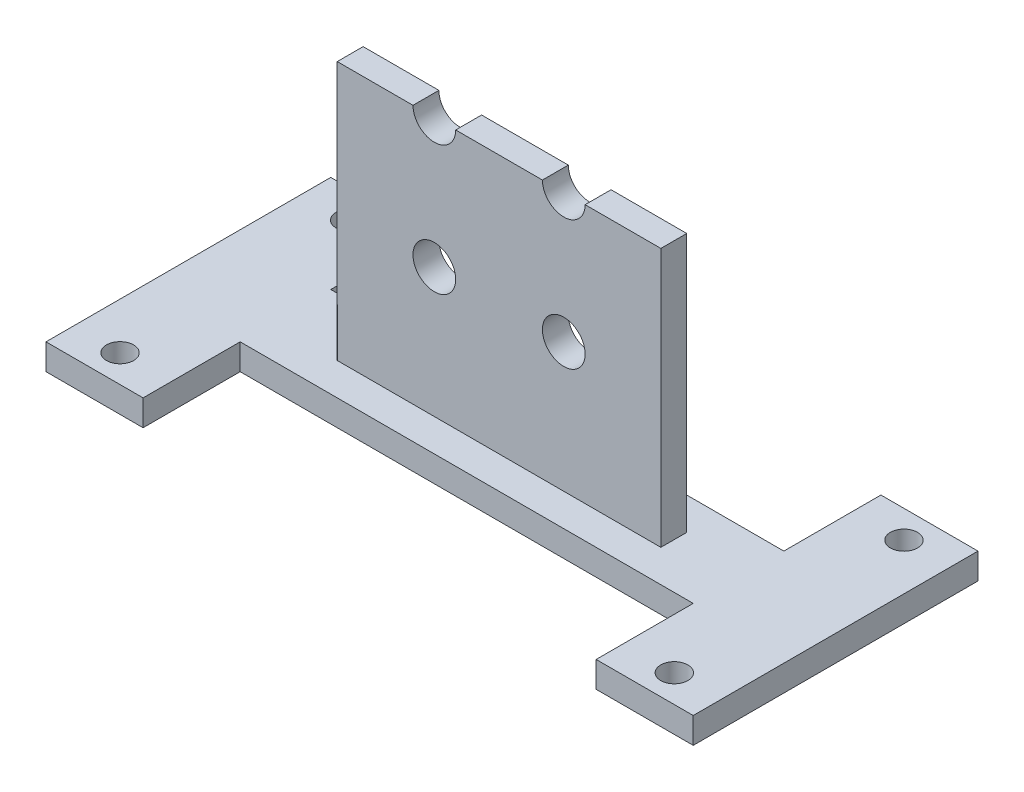
ISO-10303-21;
HEADER;
FILE_DESCRIPTION(('STEP AP214'),'2;1');
FILE_NAME('part.step','',(''),(''),'','','');
FILE_SCHEMA(('AUTOMOTIVE_DESIGN { 1 0 10303 214 1 1 1 1 }'));
ENDSEC;
DATA;
#1=APPLICATION_CONTEXT('core data for automotive mechanical design processes');
#2=APPLICATION_PROTOCOL_DEFINITION('international standard','automotive_design',2000,#1);
#3=PRODUCT_CONTEXT('',#1,'mechanical');
#4=PRODUCT('Part','Part','',(#3));
#5=PRODUCT_RELATED_PRODUCT_CATEGORY('part','',(#4));
#6=PRODUCT_DEFINITION_FORMATION('','',#4);
#7=PRODUCT_DEFINITION_CONTEXT('part definition',#1,'design');
#8=PRODUCT_DEFINITION('design','',#6,#7);
#9=PRODUCT_DEFINITION_SHAPE('','',#8);
#10=(LENGTH_UNIT() NAMED_UNIT(*) SI_UNIT(.MILLI.,.METRE.));
#11=(NAMED_UNIT(*) PLANE_ANGLE_UNIT() SI_UNIT($,.RADIAN.));
#12=(NAMED_UNIT(*) SI_UNIT($,.STERADIAN.) SOLID_ANGLE_UNIT());
#13=UNCERTAINTY_MEASURE_WITH_UNIT(LENGTH_MEASURE(1.E-05),#10,'distance_accuracy_value','');
#14=(GEOMETRIC_REPRESENTATION_CONTEXT(3) GLOBAL_UNCERTAINTY_ASSIGNED_CONTEXT((#13)) GLOBAL_UNIT_ASSIGNED_CONTEXT((#10,
#11,#12)) REPRESENTATION_CONTEXT('',''));
#15=CARTESIAN_POINT('',(0.,0.,0.));
#16=DIRECTION('',(0.,0.,1.));
#17=DIRECTION('',(1.,0.,0.));
#18=AXIS2_PLACEMENT_3D('',#15,#16,#17);
#19=CARTESIAN_POINT('',(-25.,2.,-11.));
#20=DIRECTION('',(0.,0.,1.));
#21=DIRECTION('',(1.,0.,0.));
#22=AXIS2_PLACEMENT_3D('',#19,#20,#21);
#23=PLANE('',#22);
#24=DIRECTION('',(-1.,0.,0.));
#25=VECTOR('',#24,1.);
#26=CARTESIAN_POINT('',(-25.,2.,-11.));
#27=LINE('',#26,#25);
#28=CARTESIAN_POINT('',(-17.5,2.,-11.));
#29=VERTEX_POINT('',#28);
#30=CARTESIAN_POINT('',(-25.,2.,-11.));
#31=VERTEX_POINT('',#30);
#32=EDGE_CURVE('E359',#29,#31,#27,.T.);
#33=ORIENTED_EDGE('',*,*,#32,.F.);
#34=DIRECTION('',(0.,-1.,0.));
#35=VECTOR('',#34,1.);
#36=CARTESIAN_POINT('',(-17.5,2.,-11.));
#37=LINE('',#36,#35);
#38=CARTESIAN_POINT('',(-17.5,0.,-11.));
#39=VERTEX_POINT('',#38);
#40=EDGE_CURVE('E427',#29,#39,#37,.T.);
#41=ORIENTED_EDGE('',*,*,#40,.T.);
#42=DIRECTION('',(-1.,0.,0.));
#43=VECTOR('',#42,1.);
#44=CARTESIAN_POINT('',(-25.,0.,-11.));
#45=LINE('',#44,#43);
#46=CARTESIAN_POINT('',(-25.,0.,-11.));
#47=VERTEX_POINT('',#46);
#48=EDGE_CURVE('E376',#39,#47,#45,.T.);
#49=ORIENTED_EDGE('',*,*,#48,.T.);
#50=DIRECTION('',(0.,-1.,0.));
#51=VECTOR('',#50,1.);
#52=CARTESIAN_POINT('',(-25.,2.,-11.));
#53=LINE('',#52,#51);
#54=EDGE_CURVE('E395',#31,#47,#53,.T.);
#55=ORIENTED_EDGE('',*,*,#54,.F.);
#56=EDGE_LOOP('',(#33,#41,#49,#55));
#57=FACE_BOUND('',#56,.T.);
#58=ADVANCED_FACE('F45',(#57),#23,.F.);
#59=CARTESIAN_POINT('',(-25.,2.,11.));
#60=DIRECTION('',(0.,0.,-1.));
#61=DIRECTION('',(-1.,0.,0.));
#62=AXIS2_PLACEMENT_3D('',#59,#60,#61);
#63=PLANE('',#62);
#64=DIRECTION('',(1.,0.,0.));
#65=VECTOR('',#64,1.);
#66=CARTESIAN_POINT('',(-25.,2.,11.));
#67=LINE('',#66,#65);
#68=CARTESIAN_POINT('',(17.5,2.,11.));
#69=VERTEX_POINT('',#68);
#70=CARTESIAN_POINT('',(25.,2.,11.));
#71=VERTEX_POINT('',#70);
#72=EDGE_CURVE('E368',#69,#71,#67,.T.);
#73=ORIENTED_EDGE('',*,*,#72,.F.);
#74=DIRECTION('',(0.,-1.,0.));
#75=VECTOR('',#74,1.);
#76=CARTESIAN_POINT('',(17.5,2.,11.));
#77=LINE('',#76,#75);
#78=CARTESIAN_POINT('',(17.5,0.,11.));
#79=VERTEX_POINT('',#78);
#80=EDGE_CURVE('E198',#69,#79,#77,.T.);
#81=ORIENTED_EDGE('',*,*,#80,.T.);
#82=DIRECTION('',(1.,0.,0.));
#83=VECTOR('',#82,1.);
#84=CARTESIAN_POINT('',(-25.,0.,11.));
#85=LINE('',#84,#83);
#86=CARTESIAN_POINT('',(25.,0.,11.));
#87=VERTEX_POINT('',#86);
#88=EDGE_CURVE('E384',#79,#87,#85,.T.);
#89=ORIENTED_EDGE('',*,*,#88,.T.);
#90=DIRECTION('',(0.,-1.,0.));
#91=VECTOR('',#90,1.);
#92=CARTESIAN_POINT('',(25.,2.,11.));
#93=LINE('',#92,#91);
#94=EDGE_CURVE('E372',#71,#87,#93,.T.);
#95=ORIENTED_EDGE('',*,*,#94,.F.);
#96=EDGE_LOOP('',(#73,#81,#89,#95));
#97=FACE_BOUND('',#96,.T.);
#98=ADVANCED_FACE('F501',(#97),#63,.F.);
#99=CARTESIAN_POINT('',(0.,22.,0.));
#100=DIRECTION('',(0.,-1.,0.));
#101=DIRECTION('',(0.,0.,-1.));
#102=AXIS2_PLACEMENT_3D('',#99,#100,#101);
#103=PLANE('',#102);
#104=DIRECTION('',(-1.,0.,0.));
#105=VECTOR('',#104,1.);
#106=CARTESIAN_POINT('',(-12.5,22.,-1.));
#107=LINE('',#106,#105);
#108=CARTESIAN_POINT('',(12.5,22.,-1.));
#109=VERTEX_POINT('',#108);
#110=CARTESIAN_POINT('',(6.65,22.,-1.));
#111=VERTEX_POINT('',#110);
#112=EDGE_CURVE('E278',#109,#111,#107,.T.);
#113=ORIENTED_EDGE('',*,*,#112,.T.);
#114=DIRECTION('',(0.,0.,1.));
#115=VECTOR('',#114,1.);
#116=CARTESIAN_POINT('',(6.65,22.,-29.));
#117=LINE('',#116,#115);
#118=CARTESIAN_POINT('',(6.65,22.,1.));
#119=VERTEX_POINT('',#118);
#120=EDGE_CURVE('E415',#111,#119,#117,.T.);
#121=ORIENTED_EDGE('',*,*,#120,.T.);
#122=DIRECTION('',(1.,0.,0.));
#123=VECTOR('',#122,1.);
#124=CARTESIAN_POINT('',(-12.5,22.,1.));
#125=LINE('',#124,#123);
#126=CARTESIAN_POINT('',(12.5,22.,1.));
#127=VERTEX_POINT('',#126);
#128=EDGE_CURVE('E286',#119,#127,#125,.T.);
#129=ORIENTED_EDGE('',*,*,#128,.T.);
#130=DIRECTION('',(0.,0.,-1.));
#131=VECTOR('',#130,1.);
#132=CARTESIAN_POINT('',(12.5,22.,1.));
#133=LINE('',#132,#131);
#134=EDGE_CURVE('E272',#127,#109,#133,.T.);
#135=ORIENTED_EDGE('',*,*,#134,.T.);
#136=EDGE_LOOP('',(#113,#121,#129,#135));
#137=FACE_BOUND('',#136,.T.);
#138=ADVANCED_FACE('F481',(#137),#103,.F.);
#139=CARTESIAN_POINT('',(-3.35,22.,1.));
#140=VERTEX_POINT('',#139);
#141=CARTESIAN_POINT('',(3.35,22.,1.));
#142=VERTEX_POINT('',#141);
#143=EDGE_CURVE('E292',#140,#142,#125,.T.);
#144=ORIENTED_EDGE('',*,*,#143,.T.);
#145=DIRECTION('',(0.,0.,1.));
#146=VECTOR('',#145,1.);
#147=CARTESIAN_POINT('',(3.35,22.,-29.));
#148=LINE('',#147,#146);
#149=CARTESIAN_POINT('',(3.35,22.,-1.));
#150=VERTEX_POINT('',#149);
#151=EDGE_CURVE('E411',#142,#150,#148,.F.);
#152=ORIENTED_EDGE('',*,*,#151,.T.);
#153=CARTESIAN_POINT('',(-3.35,22.,-1.));
#154=VERTEX_POINT('',#153);
#155=EDGE_CURVE('E283',#150,#154,#107,.T.);
#156=ORIENTED_EDGE('',*,*,#155,.T.);
#157=DIRECTION('',(0.,0.,1.));
#158=VECTOR('',#157,1.);
#159=CARTESIAN_POINT('',(-3.35,22.,-29.));
#160=LINE('',#159,#158);
#161=EDGE_CURVE('E407',#154,#140,#160,.T.);
#162=ORIENTED_EDGE('',*,*,#161,.T.);
#163=EDGE_LOOP('',(#144,#152,#156,#162));
#164=FACE_BOUND('',#163,.T.);
#165=ADVANCED_FACE('F478',(#164),#103,.F.);
#166=CARTESIAN_POINT('',(0.,2.,0.));
#167=DIRECTION('',(0.,-1.,0.));
#168=DIRECTION('',(0.,0.,-1.));
#169=AXIS2_PLACEMENT_3D('',#166,#167,#168);
#170=PLANE('',#169);
#171=CARTESIAN_POINT('',(21.41,2.,-8.87000000000001));
#172=DIRECTION('',(0.,1.,0.));
#173=DIRECTION('',(0.,0.,-1.));
#174=AXIS2_PLACEMENT_3D('',#171,#172,#173);
#175=CIRCLE('',#174,1.05);
#176=CARTESIAN_POINT('',(21.41,2.,-9.92000000000001));
#177=VERTEX_POINT('',#176);
#178=EDGE_CURVE('E323',#177,#177,#175,.T.);
#179=ORIENTED_EDGE('',*,*,#178,.F.);
#180=EDGE_LOOP('',(#179));
#181=FACE_BOUND('',#180,.T.);
#182=CARTESIAN_POINT('',(21.41,2.,8.87));
#183=DIRECTION('',(0.,1.,0.));
#184=DIRECTION('',(0.,0.,1.));
#185=AXIS2_PLACEMENT_3D('',#182,#183,#184);
#186=CIRCLE('',#185,1.05);
#187=CARTESIAN_POINT('',(21.41,2.,9.92));
#188=VERTEX_POINT('',#187);
#189=EDGE_CURVE('E331',#188,#188,#186,.T.);
#190=ORIENTED_EDGE('',*,*,#189,.F.);
#191=EDGE_LOOP('',(#190));
#192=FACE_BOUND('',#191,.T.);
#193=CARTESIAN_POINT('',(-21.41,2.,8.87));
#194=DIRECTION('',(0.,1.,0.));
#195=DIRECTION('',(0.,0.,-1.));
#196=AXIS2_PLACEMENT_3D('',#193,#194,#195);
#197=CIRCLE('',#196,1.05);
#198=CARTESIAN_POINT('',(-21.41,2.,7.82));
#199=VERTEX_POINT('',#198);
#200=EDGE_CURVE('E339',#199,#199,#197,.T.);
#201=ORIENTED_EDGE('',*,*,#200,.F.);
#202=EDGE_LOOP('',(#201));
#203=FACE_BOUND('',#202,.T.);
#204=CARTESIAN_POINT('',(-21.41,2.,-8.87));
#205=DIRECTION('',(0.,1.,0.));
#206=DIRECTION('',(0.,0.,1.));
#207=AXIS2_PLACEMENT_3D('',#204,#205,#206);
#208=CIRCLE('',#207,1.05);
#209=CARTESIAN_POINT('',(-21.41,2.,-7.82));
#210=VERTEX_POINT('',#209);
#211=EDGE_CURVE('E347',#210,#210,#208,.T.);
#212=ORIENTED_EDGE('',*,*,#211,.F.);
#213=EDGE_LOOP('',(#212));
#214=FACE_BOUND('',#213,.T.);
#215=DIRECTION('',(-1.,0.,0.));
#216=VECTOR('',#215,1.);
#217=CARTESIAN_POINT('',(-17.5,2.,3.5));
#218=LINE('',#217,#216);
#219=CARTESIAN_POINT('',(17.5,2.,3.5));
#220=VERTEX_POINT('',#219);
#221=CARTESIAN_POINT('',(-17.5,2.,3.5));
#222=VERTEX_POINT('',#221);
#223=EDGE_CURVE('E187',#220,#222,#218,.T.);
#224=ORIENTED_EDGE('',*,*,#223,.F.);
#225=DIRECTION('',(0.,0.,-1.));
#226=VECTOR('',#225,1.);
#227=CARTESIAN_POINT('',(17.5,2.,18.5));
#228=LINE('',#227,#226);
#229=EDGE_CURVE('E195',#69,#220,#228,.T.);
#230=ORIENTED_EDGE('',*,*,#229,.F.);
#231=ORIENTED_EDGE('',*,*,#72,.T.);
#232=DIRECTION('',(0.,0.,-1.));
#233=VECTOR('',#232,1.);
#234=CARTESIAN_POINT('',(25.,2.,11.));
#235=LINE('',#234,#233);
#236=CARTESIAN_POINT('',(25.,2.,-11.));
#237=VERTEX_POINT('',#236);
#238=EDGE_CURVE('E355',#71,#237,#235,.T.);
#239=ORIENTED_EDGE('',*,*,#238,.T.);
#240=CARTESIAN_POINT('',(17.5,2.,-11.));
#241=VERTEX_POINT('',#240);
#242=EDGE_CURVE('E361',#237,#241,#27,.T.);
#243=ORIENTED_EDGE('',*,*,#242,.T.);
#244=DIRECTION('',(0.,0.,-1.));
#245=VECTOR('',#244,1.);
#246=CARTESIAN_POINT('',(17.5,2.,-18.5));
#247=LINE('',#246,#245);
#248=CARTESIAN_POINT('',(17.5,2.,-3.5));
#249=VERTEX_POINT('',#248);
#250=EDGE_CURVE('E61',#249,#241,#247,.T.);
#251=ORIENTED_EDGE('',*,*,#250,.F.);
#252=DIRECTION('',(1.,0.,0.));
#253=VECTOR('',#252,1.);
#254=CARTESIAN_POINT('',(-17.5,2.,-3.5));
#255=LINE('',#254,#253);
#256=CARTESIAN_POINT('',(-17.5,2.,-3.5));
#257=VERTEX_POINT('',#256);
#258=EDGE_CURVE('E223',#257,#249,#255,.T.);
#259=ORIENTED_EDGE('',*,*,#258,.F.);
#260=DIRECTION('',(0.,0.,1.));
#261=VECTOR('',#260,1.);
#262=CARTESIAN_POINT('',(-17.5,2.,-18.5));
#263=LINE('',#262,#261);
#264=EDGE_CURVE('E202',#29,#257,#263,.T.);
#265=ORIENTED_EDGE('',*,*,#264,.F.);
#266=ORIENTED_EDGE('',*,*,#32,.T.);
#267=DIRECTION('',(0.,0.,1.));
#268=VECTOR('',#267,1.);
#269=CARTESIAN_POINT('',(-25.,2.,11.));
#270=LINE('',#269,#268);
#271=CARTESIAN_POINT('',(-25.,2.,11.));
#272=VERTEX_POINT('',#271);
#273=EDGE_CURVE('E365',#31,#272,#270,.T.);
#274=ORIENTED_EDGE('',*,*,#273,.T.);
#275=CARTESIAN_POINT('',(-17.5,2.,11.));
#276=VERTEX_POINT('',#275);
#277=EDGE_CURVE('E369',#272,#276,#67,.T.);
#278=ORIENTED_EDGE('',*,*,#277,.T.);
#279=DIRECTION('',(0.,0.,1.));
#280=VECTOR('',#279,1.);
#281=CARTESIAN_POINT('',(-17.5,2.,18.5));
#282=LINE('',#281,#280);
#283=EDGE_CURVE('E69',#222,#276,#282,.T.);
#284=ORIENTED_EDGE('',*,*,#283,.F.);
#285=EDGE_LOOP('',(#224,#230,#231,#239,#243,#251,#259,#265,#266,#274,#278,#284));
#286=FACE_BOUND('',#285,.T.);
#287=DIRECTION('',(0.,0.,-1.));
#288=VECTOR('',#287,1.);
#289=CARTESIAN_POINT('',(12.5,2.,1.));
#290=LINE('',#289,#288);
#291=CARTESIAN_POINT('',(12.5,2.,1.));
#292=VERTEX_POINT('',#291);
#293=CARTESIAN_POINT('',(12.5,2.,-1.));
#294=VERTEX_POINT('',#293);
#295=EDGE_CURVE('E271',#292,#294,#290,.T.);
#296=ORIENTED_EDGE('',*,*,#295,.F.);
#297=DIRECTION('',(1.,0.,0.));
#298=VECTOR('',#297,1.);
#299=CARTESIAN_POINT('',(-12.5,2.,1.));
#300=LINE('',#299,#298);
#301=CARTESIAN_POINT('',(-12.5,2.,1.));
#302=VERTEX_POINT('',#301);
#303=EDGE_CURVE('E277',#302,#292,#300,.T.);
#304=ORIENTED_EDGE('',*,*,#303,.F.);
#305=DIRECTION('',(0.,0.,1.));
#306=VECTOR('',#305,1.);
#307=CARTESIAN_POINT('',(-12.5,2.,1.));
#308=LINE('',#307,#306);
#309=CARTESIAN_POINT('',(-12.5,2.,-1.));
#310=VERTEX_POINT('',#309);
#311=EDGE_CURVE('E300',#310,#302,#308,.T.);
#312=ORIENTED_EDGE('',*,*,#311,.F.);
#313=DIRECTION('',(-1.,0.,0.));
#314=VECTOR('',#313,1.);
#315=CARTESIAN_POINT('',(-12.5,2.,-1.));
#316=LINE('',#315,#314);
#317=EDGE_CURVE('E296',#294,#310,#316,.T.);
#318=ORIENTED_EDGE('',*,*,#317,.F.);
#319=EDGE_LOOP('',(#296,#304,#312,#318));
#320=FACE_BOUND('',#319,.T.);
#321=ADVANCED_FACE('F204',(#181,#192,#203,#214,#286,#320),#170,.F.);
#322=CARTESIAN_POINT('',(0.,0.,0.));
#323=DIRECTION('',(0.,-1.,0.));
#324=DIRECTION('',(0.,0.,-1.));
#325=AXIS2_PLACEMENT_3D('',#322,#323,#324);
#326=PLANE('',#325);
#327=DIRECTION('',(0.,0.,1.));
#328=VECTOR('',#327,1.);
#329=CARTESIAN_POINT('',(17.5,0.,0.));
#330=LINE('',#329,#328);
#331=CARTESIAN_POINT('',(17.5,0.,3.5));
#332=VERTEX_POINT('',#331);
#333=EDGE_CURVE('E232',#332,#79,#330,.T.);
#334=ORIENTED_EDGE('',*,*,#333,.F.);
#335=DIRECTION('',(1.,0.,0.));
#336=VECTOR('',#335,1.);
#337=CARTESIAN_POINT('',(0.,0.,3.5));
#338=LINE('',#337,#336);
#339=CARTESIAN_POINT('',(-17.5,0.,3.5));
#340=VERTEX_POINT('',#339);
#341=EDGE_CURVE('E11',#340,#332,#338,.T.);
#342=ORIENTED_EDGE('',*,*,#341,.F.);
#343=DIRECTION('',(0.,0.,-1.));
#344=VECTOR('',#343,1.);
#345=CARTESIAN_POINT('',(-17.5,0.,0.));
#346=LINE('',#345,#344);
#347=CARTESIAN_POINT('',(-17.5,0.,11.));
#348=VERTEX_POINT('',#347);
#349=EDGE_CURVE('E213',#348,#340,#346,.T.);
#350=ORIENTED_EDGE('',*,*,#349,.F.);
#351=CARTESIAN_POINT('',(-25.,0.,11.));
#352=VERTEX_POINT('',#351);
#353=EDGE_CURVE('E360',#352,#348,#85,.T.);
#354=ORIENTED_EDGE('',*,*,#353,.F.);
#355=DIRECTION('',(0.,0.,1.));
#356=VECTOR('',#355,1.);
#357=CARTESIAN_POINT('',(-25.,0.,11.));
#358=LINE('',#357,#356);
#359=EDGE_CURVE('E381',#47,#352,#358,.T.);
#360=ORIENTED_EDGE('',*,*,#359,.F.);
#361=ORIENTED_EDGE('',*,*,#48,.F.);
#362=DIRECTION('',(0.,0.,-1.));
#363=VECTOR('',#362,1.);
#364=CARTESIAN_POINT('',(-17.5,0.,0.));
#365=LINE('',#364,#363);
#366=CARTESIAN_POINT('',(-17.5,0.,-3.5));
#367=VERTEX_POINT('',#366);
#368=EDGE_CURVE('E238',#367,#39,#365,.T.);
#369=ORIENTED_EDGE('',*,*,#368,.F.);
#370=DIRECTION('',(-1.,0.,0.));
#371=VECTOR('',#370,1.);
#372=CARTESIAN_POINT('',(0.,0.,-3.5));
#373=LINE('',#372,#371);
#374=CARTESIAN_POINT('',(17.5,0.,-3.5));
#375=VERTEX_POINT('',#374);
#376=EDGE_CURVE('E54',#375,#367,#373,.T.);
#377=ORIENTED_EDGE('',*,*,#376,.F.);
#378=DIRECTION('',(0.,0.,1.));
#379=VECTOR('',#378,1.);
#380=CARTESIAN_POINT('',(17.5,0.,0.));
#381=LINE('',#380,#379);
#382=CARTESIAN_POINT('',(17.5,0.,-11.));
#383=VERTEX_POINT('',#382);
#384=EDGE_CURVE('E235',#383,#375,#381,.T.);
#385=ORIENTED_EDGE('',*,*,#384,.F.);
#386=CARTESIAN_POINT('',(25.,0.,-11.));
#387=VERTEX_POINT('',#386);
#388=EDGE_CURVE('E377',#387,#383,#45,.T.);
#389=ORIENTED_EDGE('',*,*,#388,.F.);
#390=DIRECTION('',(0.,0.,-1.));
#391=VECTOR('',#390,1.);
#392=CARTESIAN_POINT('',(25.,0.,11.));
#393=LINE('',#392,#391);
#394=EDGE_CURVE('E351',#87,#387,#393,.T.);
#395=ORIENTED_EDGE('',*,*,#394,.F.);
#396=ORIENTED_EDGE('',*,*,#88,.F.);
#397=EDGE_LOOP('',(#334,#342,#350,#354,#360,#361,#369,#377,#385,#389,#395,#396));
#398=FACE_BOUND('',#397,.T.);
#399=CARTESIAN_POINT('',(21.41,0.,8.87));
#400=DIRECTION('',(0.,1.,0.));
#401=DIRECTION('',(0.,0.,1.));
#402=AXIS2_PLACEMENT_3D('',#399,#400,#401);
#403=CIRCLE('',#402,1.05);
#404=CARTESIAN_POINT('',(21.41,0.,9.92));
#405=VERTEX_POINT('',#404);
#406=EDGE_CURVE('E327',#405,#405,#403,.T.);
#407=ORIENTED_EDGE('',*,*,#406,.T.);
#408=EDGE_LOOP('',(#407));
#409=FACE_BOUND('',#408,.T.);
#410=CARTESIAN_POINT('',(-21.41,0.,-8.87));
#411=DIRECTION('',(0.,1.,0.));
#412=DIRECTION('',(0.,0.,1.));
#413=AXIS2_PLACEMENT_3D('',#410,#411,#412);
#414=CIRCLE('',#413,1.05);
#415=CARTESIAN_POINT('',(-21.41,0.,-7.82));
#416=VERTEX_POINT('',#415);
#417=EDGE_CURVE('E343',#416,#416,#414,.T.);
#418=ORIENTED_EDGE('',*,*,#417,.T.);
#419=EDGE_LOOP('',(#418));
#420=FACE_BOUND('',#419,.T.);
#421=CARTESIAN_POINT('',(-21.41,0.,8.87));
#422=DIRECTION('',(0.,1.,0.));
#423=DIRECTION('',(0.,0.,-1.));
#424=AXIS2_PLACEMENT_3D('',#421,#422,#423);
#425=CIRCLE('',#424,1.05);
#426=CARTESIAN_POINT('',(-21.41,0.,7.82));
#427=VERTEX_POINT('',#426);
#428=EDGE_CURVE('E335',#427,#427,#425,.T.);
#429=ORIENTED_EDGE('',*,*,#428,.T.);
#430=EDGE_LOOP('',(#429));
#431=FACE_BOUND('',#430,.T.);
#432=CARTESIAN_POINT('',(21.41,0.,-8.87000000000001));
#433=DIRECTION('',(0.,1.,0.));
#434=DIRECTION('',(0.,0.,-1.));
#435=AXIS2_PLACEMENT_3D('',#432,#433,#434);
#436=CIRCLE('',#435,1.05);
#437=CARTESIAN_POINT('',(21.41,0.,-9.92000000000001));
#438=VERTEX_POINT('',#437);
#439=EDGE_CURVE('E322',#438,#438,#436,.T.);
#440=ORIENTED_EDGE('',*,*,#439,.T.);
#441=EDGE_LOOP('',(#440));
#442=FACE_BOUND('',#441,.T.);
#443=ADVANCED_FACE('F444',(#398,#409,#420,#431,#442),#326,.T.);
#444=CARTESIAN_POINT('',(25.,2.,11.));
#445=DIRECTION('',(-1.,0.,0.));
#446=DIRECTION('',(0.,0.,1.));
#447=AXIS2_PLACEMENT_3D('',#444,#445,#446);
#448=PLANE('',#447);
#449=ORIENTED_EDGE('',*,*,#394,.T.);
#450=DIRECTION('',(0.,-1.,0.));
#451=VECTOR('',#450,1.);
#452=CARTESIAN_POINT('',(25.,2.,-11.));
#453=LINE('',#452,#451);
#454=EDGE_CURVE('E399',#237,#387,#453,.T.);
#455=ORIENTED_EDGE('',*,*,#454,.F.);
#456=ORIENTED_EDGE('',*,*,#238,.F.);
#457=ORIENTED_EDGE('',*,*,#94,.T.);
#458=EDGE_LOOP('',(#449,#455,#456,#457));
#459=FACE_BOUND('',#458,.T.);
#460=ADVANCED_FACE('F47',(#459),#448,.F.);
#461=ORIENTED_EDGE('',*,*,#388,.T.);
#462=DIRECTION('',(0.,1.,0.));
#463=VECTOR('',#462,1.);
#464=CARTESIAN_POINT('',(17.5,2.,-11.));
#465=LINE('',#464,#463);
#466=EDGE_CURVE('E424',#383,#241,#465,.T.);
#467=ORIENTED_EDGE('',*,*,#466,.T.);
#468=ORIENTED_EDGE('',*,*,#242,.F.);
#469=ORIENTED_EDGE('',*,*,#454,.T.);
#470=EDGE_LOOP('',(#461,#467,#468,#469));
#471=FACE_BOUND('',#470,.T.);
#472=ADVANCED_FACE('F502',(#471),#23,.F.);
#473=CARTESIAN_POINT('',(-25.,2.,11.));
#474=DIRECTION('',(1.,0.,0.));
#475=DIRECTION('',(0.,0.,-1.));
#476=AXIS2_PLACEMENT_3D('',#473,#474,#475);
#477=PLANE('',#476);
#478=ORIENTED_EDGE('',*,*,#359,.T.);
#479=DIRECTION('',(0.,-1.,0.));
#480=VECTOR('',#479,1.);
#481=CARTESIAN_POINT('',(-25.,2.,11.));
#482=LINE('',#481,#480);
#483=EDGE_CURVE('E391',#272,#352,#482,.T.);
#484=ORIENTED_EDGE('',*,*,#483,.F.);
#485=ORIENTED_EDGE('',*,*,#273,.F.);
#486=ORIENTED_EDGE('',*,*,#54,.T.);
#487=EDGE_LOOP('',(#478,#484,#485,#486));
#488=FACE_BOUND('',#487,.T.);
#489=ADVANCED_FACE('F513',(#488),#477,.F.);
#490=ORIENTED_EDGE('',*,*,#353,.T.);
#491=DIRECTION('',(0.,1.,0.));
#492=VECTOR('',#491,1.);
#493=CARTESIAN_POINT('',(-17.5,2.,11.));
#494=LINE('',#493,#492);
#495=EDGE_CURVE('E419',#348,#276,#494,.T.);
#496=ORIENTED_EDGE('',*,*,#495,.T.);
#497=ORIENTED_EDGE('',*,*,#277,.F.);
#498=ORIENTED_EDGE('',*,*,#483,.T.);
#499=EDGE_LOOP('',(#490,#496,#497,#498));
#500=FACE_BOUND('',#499,.T.);
#501=ADVANCED_FACE('F509',(#500),#63,.F.);
#502=CARTESIAN_POINT('',(-21.41,2.,-8.87));
#503=DIRECTION('',(0.,-1.,0.));
#504=DIRECTION('',(0.,0.,-1.));
#505=AXIS2_PLACEMENT_3D('',#502,#503,#504);
#506=CYLINDRICAL_SURFACE('',#505,1.05);
#507=ORIENTED_EDGE('',*,*,#211,.T.);
#508=EDGE_LOOP('',(#507));
#509=FACE_BOUND('',#508,.T.);
#510=ORIENTED_EDGE('',*,*,#417,.F.);
#511=EDGE_LOOP('',(#510));
#512=FACE_BOUND('',#511,.T.);
#513=ADVANCED_FACE('F585',(#509,#512),#506,.F.);
#514=CARTESIAN_POINT('',(-21.41,2.,8.87));
#515=DIRECTION('',(0.,-1.,0.));
#516=DIRECTION('',(0.,0.,-1.));
#517=AXIS2_PLACEMENT_3D('',#514,#515,#516);
#518=CYLINDRICAL_SURFACE('',#517,1.05);
#519=ORIENTED_EDGE('',*,*,#200,.T.);
#520=EDGE_LOOP('',(#519));
#521=FACE_BOUND('',#520,.T.);
#522=ORIENTED_EDGE('',*,*,#428,.F.);
#523=EDGE_LOOP('',(#522));
#524=FACE_BOUND('',#523,.T.);
#525=ADVANCED_FACE('F581',(#521,#524),#518,.F.);
#526=CARTESIAN_POINT('',(21.41,2.,8.87));
#527=DIRECTION('',(0.,-1.,0.));
#528=DIRECTION('',(0.,0.,-1.));
#529=AXIS2_PLACEMENT_3D('',#526,#527,#528);
#530=CYLINDRICAL_SURFACE('',#529,1.05);
#531=ORIENTED_EDGE('',*,*,#189,.T.);
#532=EDGE_LOOP('',(#531));
#533=FACE_BOUND('',#532,.T.);
#534=ORIENTED_EDGE('',*,*,#406,.F.);
#535=EDGE_LOOP('',(#534));
#536=FACE_BOUND('',#535,.T.);
#537=ADVANCED_FACE('F577',(#533,#536),#530,.F.);
#538=CARTESIAN_POINT('',(21.41,2.,-8.87000000000001));
#539=DIRECTION('',(0.,-1.,0.));
#540=DIRECTION('',(0.,0.,-1.));
#541=AXIS2_PLACEMENT_3D('',#538,#539,#540);
#542=CYLINDRICAL_SURFACE('',#541,1.05);
#543=ORIENTED_EDGE('',*,*,#178,.T.);
#544=EDGE_LOOP('',(#543));
#545=FACE_BOUND('',#544,.T.);
#546=ORIENTED_EDGE('',*,*,#439,.F.);
#547=EDGE_LOOP('',(#546));
#548=FACE_BOUND('',#547,.T.);
#549=ADVANCED_FACE('F571',(#545,#548),#542,.F.);
#550=CARTESIAN_POINT('',(12.5,22.,1.));
#551=DIRECTION('',(-1.,0.,0.));
#552=DIRECTION('',(0.,0.,1.));
#553=AXIS2_PLACEMENT_3D('',#550,#551,#552);
#554=PLANE('',#553);
#555=ORIENTED_EDGE('',*,*,#295,.T.);
#556=DIRECTION('',(0.,-1.,0.));
#557=VECTOR('',#556,1.);
#558=CARTESIAN_POINT('',(12.5,22.,-1.));
#559=LINE('',#558,#557);
#560=EDGE_CURVE('E318',#109,#294,#559,.T.);
#561=ORIENTED_EDGE('',*,*,#560,.F.);
#562=ORIENTED_EDGE('',*,*,#134,.F.);
#563=DIRECTION('',(0.,-1.,0.));
#564=VECTOR('',#563,1.);
#565=CARTESIAN_POINT('',(12.5,22.,1.));
#566=LINE('',#565,#564);
#567=EDGE_CURVE('E291',#127,#292,#566,.T.);
#568=ORIENTED_EDGE('',*,*,#567,.T.);
#569=EDGE_LOOP('',(#555,#561,#562,#568));
#570=FACE_BOUND('',#569,.T.);
#571=ADVANCED_FACE('F486',(#570),#554,.F.);
#572=CARTESIAN_POINT('',(-12.5,22.,-1.));
#573=DIRECTION('',(0.,0.,1.));
#574=DIRECTION('',(1.,0.,0.));
#575=AXIS2_PLACEMENT_3D('',#572,#573,#574);
#576=PLANE('',#575);
#577=CARTESIAN_POINT('',(5.,12.,-1.));
#578=DIRECTION('',(0.,0.,1.));
#579=DIRECTION('',(1.,0.,0.));
#580=AXIS2_PLACEMENT_3D('',#577,#578,#579);
#581=CIRCLE('',#580,1.65);
#582=CARTESIAN_POINT('',(6.65,12.,-1.));
#583=VERTEX_POINT('',#582);
#584=EDGE_CURVE('E267',#583,#583,#581,.T.);
#585=ORIENTED_EDGE('',*,*,#584,.T.);
#586=EDGE_LOOP('',(#585));
#587=FACE_BOUND('',#586,.T.);
#588=CARTESIAN_POINT('',(-5.,12.,-1.));
#589=DIRECTION('',(0.,0.,1.));
#590=DIRECTION('',(1.,0.,0.));
#591=AXIS2_PLACEMENT_3D('',#588,#589,#590);
#592=CIRCLE('',#591,1.65);
#593=CARTESIAN_POINT('',(-3.35,12.,-1.));
#594=VERTEX_POINT('',#593);
#595=EDGE_CURVE('E263',#594,#594,#592,.T.);
#596=ORIENTED_EDGE('',*,*,#595,.T.);
#597=EDGE_LOOP('',(#596));
#598=FACE_BOUND('',#597,.T.);
#599=ORIENTED_EDGE('',*,*,#155,.F.);
#600=CARTESIAN_POINT('',(5.,22.,-1.));
#601=DIRECTION('',(0.,0.,1.));
#602=DIRECTION('',(1.,0.,0.));
#603=AXIS2_PLACEMENT_3D('',#600,#601,#602);
#604=CIRCLE('',#603,1.65);
#605=EDGE_CURVE('E259',#150,#111,#604,.T.);
#606=ORIENTED_EDGE('',*,*,#605,.T.);
#607=ORIENTED_EDGE('',*,*,#112,.F.);
#608=ORIENTED_EDGE('',*,*,#560,.T.);
#609=ORIENTED_EDGE('',*,*,#317,.T.);
#610=DIRECTION('',(0.,-1.,0.));
#611=VECTOR('',#610,1.);
#612=CARTESIAN_POINT('',(-12.5,22.,-1.));
#613=LINE('',#612,#611);
#614=CARTESIAN_POINT('',(-12.5,22.,-1.));
#615=VERTEX_POINT('',#614);
#616=EDGE_CURVE('E314',#615,#310,#613,.T.);
#617=ORIENTED_EDGE('',*,*,#616,.F.);
#618=CARTESIAN_POINT('',(-6.65,22.,-1.));
#619=VERTEX_POINT('',#618);
#620=EDGE_CURVE('E276',#619,#615,#107,.T.);
#621=ORIENTED_EDGE('',*,*,#620,.F.);
#622=CARTESIAN_POINT('',(-5.,22.,-1.));
#623=DIRECTION('',(0.,0.,1.));
#624=DIRECTION('',(1.,0.,0.));
#625=AXIS2_PLACEMENT_3D('',#622,#623,#624);
#626=CIRCLE('',#625,1.65);
#627=EDGE_CURVE('E255',#619,#154,#626,.T.);
#628=ORIENTED_EDGE('',*,*,#627,.T.);
#629=EDGE_LOOP('',(#599,#606,#607,#608,#609,#617,#621,#628));
#630=FACE_BOUND('',#629,.T.);
#631=ADVANCED_FACE('F465',(#587,#598,#630),#576,.F.);
#632=CARTESIAN_POINT('',(-12.5,22.,1.));
#633=DIRECTION('',(1.,0.,0.));
#634=DIRECTION('',(0.,0.,-1.));
#635=AXIS2_PLACEMENT_3D('',#632,#633,#634);
#636=PLANE('',#635);
#637=ORIENTED_EDGE('',*,*,#311,.T.);
#638=DIRECTION('',(0.,-1.,0.));
#639=VECTOR('',#638,1.);
#640=CARTESIAN_POINT('',(-12.5,22.,1.));
#641=LINE('',#640,#639);
#642=CARTESIAN_POINT('',(-12.5,22.,1.));
#643=VERTEX_POINT('',#642);
#644=EDGE_CURVE('E310',#643,#302,#641,.T.);
#645=ORIENTED_EDGE('',*,*,#644,.F.);
#646=DIRECTION('',(0.,0.,1.));
#647=VECTOR('',#646,1.);
#648=CARTESIAN_POINT('',(-12.5,22.,1.));
#649=LINE('',#648,#647);
#650=EDGE_CURVE('E282',#615,#643,#649,.T.);
#651=ORIENTED_EDGE('',*,*,#650,.F.);
#652=ORIENTED_EDGE('',*,*,#616,.T.);
#653=EDGE_LOOP('',(#637,#645,#651,#652));
#654=FACE_BOUND('',#653,.T.);
#655=ADVANCED_FACE('F467',(#654),#636,.F.);
#656=CARTESIAN_POINT('',(-12.5,22.,1.));
#657=DIRECTION('',(0.,0.,-1.));
#658=DIRECTION('',(-1.,0.,0.));
#659=AXIS2_PLACEMENT_3D('',#656,#657,#658);
#660=PLANE('',#659);
#661=CARTESIAN_POINT('',(5.,12.,1.));
#662=DIRECTION('',(0.,0.,1.));
#663=DIRECTION('',(-1.,0.,0.));
#664=AXIS2_PLACEMENT_3D('',#661,#662,#663);
#665=CIRCLE('',#664,1.65);
#666=CARTESIAN_POINT('',(3.35,12.,1.));
#667=VERTEX_POINT('',#666);
#668=EDGE_CURVE('E247',#667,#667,#665,.T.);
#669=ORIENTED_EDGE('',*,*,#668,.F.);
#670=EDGE_LOOP('',(#669));
#671=FACE_BOUND('',#670,.T.);
#672=CARTESIAN_POINT('',(-5.,12.,1.));
#673=DIRECTION('',(0.,0.,1.));
#674=DIRECTION('',(1.,0.,0.));
#675=AXIS2_PLACEMENT_3D('',#672,#673,#674);
#676=CIRCLE('',#675,1.65);
#677=CARTESIAN_POINT('',(-3.35,12.,1.));
#678=VERTEX_POINT('',#677);
#679=EDGE_CURVE('E242',#678,#678,#676,.T.);
#680=ORIENTED_EDGE('',*,*,#679,.F.);
#681=EDGE_LOOP('',(#680));
#682=FACE_BOUND('',#681,.T.);
#683=ORIENTED_EDGE('',*,*,#128,.F.);
#684=CARTESIAN_POINT('',(5.,22.,1.));
#685=DIRECTION('',(0.,0.,1.));
#686=DIRECTION('',(-1.,0.,0.));
#687=AXIS2_PLACEMENT_3D('',#684,#685,#686);
#688=CIRCLE('',#687,1.65);
#689=EDGE_CURVE('E241',#142,#119,#688,.T.);
#690=ORIENTED_EDGE('',*,*,#689,.F.);
#691=ORIENTED_EDGE('',*,*,#143,.F.);
#692=CARTESIAN_POINT('',(-5.,22.,1.));
#693=DIRECTION('',(0.,0.,1.));
#694=DIRECTION('',(1.,0.,0.));
#695=AXIS2_PLACEMENT_3D('',#692,#693,#694);
#696=CIRCLE('',#695,1.65);
#697=CARTESIAN_POINT('',(-6.65,22.,1.));
#698=VERTEX_POINT('',#697);
#699=EDGE_CURVE('E246',#698,#140,#696,.T.);
#700=ORIENTED_EDGE('',*,*,#699,.F.);
#701=EDGE_CURVE('E287',#643,#698,#125,.T.);
#702=ORIENTED_EDGE('',*,*,#701,.F.);
#703=ORIENTED_EDGE('',*,*,#644,.T.);
#704=ORIENTED_EDGE('',*,*,#303,.T.);
#705=ORIENTED_EDGE('',*,*,#567,.F.);
#706=EDGE_LOOP('',(#683,#690,#691,#700,#702,#703,#704,#705));
#707=FACE_BOUND('',#706,.T.);
#708=ADVANCED_FACE('F472',(#671,#682,#707),#660,.F.);
#709=ORIENTED_EDGE('',*,*,#701,.T.);
#710=DIRECTION('',(0.,0.,1.));
#711=VECTOR('',#710,1.);
#712=CARTESIAN_POINT('',(-6.65,22.,-29.));
#713=LINE('',#712,#711);
#714=EDGE_CURVE('E403',#698,#619,#713,.F.);
#715=ORIENTED_EDGE('',*,*,#714,.T.);
#716=ORIENTED_EDGE('',*,*,#620,.T.);
#717=ORIENTED_EDGE('',*,*,#650,.T.);
#718=EDGE_LOOP('',(#709,#715,#716,#717));
#719=FACE_BOUND('',#718,.T.);
#720=ADVANCED_FACE('F460',(#719),#103,.F.);
#721=CARTESIAN_POINT('',(-5.,22.,-29.));
#722=DIRECTION('',(0.,0.,1.));
#723=DIRECTION('',(1.,0.,0.));
#724=AXIS2_PLACEMENT_3D('',#721,#722,#723);
#725=CYLINDRICAL_SURFACE('',#724,1.65);
#726=ORIENTED_EDGE('',*,*,#627,.F.);
#727=ORIENTED_EDGE('',*,*,#714,.F.);
#728=ORIENTED_EDGE('',*,*,#699,.T.);
#729=ORIENTED_EDGE('',*,*,#161,.F.);
#730=EDGE_LOOP('',(#726,#727,#728,#729));
#731=FACE_BOUND('',#730,.T.);
#732=ADVANCED_FACE('F476',(#731),#725,.F.);
#733=CARTESIAN_POINT('',(5.,22.,-29.));
#734=DIRECTION('',(0.,0.,1.));
#735=DIRECTION('',(1.,0.,0.));
#736=AXIS2_PLACEMENT_3D('',#733,#734,#735);
#737=CYLINDRICAL_SURFACE('',#736,1.65);
#738=ORIENTED_EDGE('',*,*,#605,.F.);
#739=ORIENTED_EDGE('',*,*,#151,.F.);
#740=ORIENTED_EDGE('',*,*,#689,.T.);
#741=ORIENTED_EDGE('',*,*,#120,.F.);
#742=EDGE_LOOP('',(#738,#739,#740,#741));
#743=FACE_BOUND('',#742,.T.);
#744=ADVANCED_FACE('F487',(#743),#737,.F.);
#745=CARTESIAN_POINT('',(-5.,12.,-29.));
#746=DIRECTION('',(0.,0.,1.));
#747=DIRECTION('',(1.,0.,0.));
#748=AXIS2_PLACEMENT_3D('',#745,#746,#747);
#749=CYLINDRICAL_SURFACE('',#748,1.65);
#750=ORIENTED_EDGE('',*,*,#679,.T.);
#751=EDGE_LOOP('',(#750));
#752=FACE_BOUND('',#751,.T.);
#753=ORIENTED_EDGE('',*,*,#595,.F.);
#754=EDGE_LOOP('',(#753));
#755=FACE_BOUND('',#754,.T.);
#756=ADVANCED_FACE('F489',(#752,#755),#749,.F.);
#757=CARTESIAN_POINT('',(5.,12.,-29.));
#758=DIRECTION('',(0.,0.,1.));
#759=DIRECTION('',(1.,0.,0.));
#760=AXIS2_PLACEMENT_3D('',#757,#758,#759);
#761=CYLINDRICAL_SURFACE('',#760,1.65);
#762=ORIENTED_EDGE('',*,*,#668,.T.);
#763=EDGE_LOOP('',(#762));
#764=FACE_BOUND('',#763,.T.);
#765=ORIENTED_EDGE('',*,*,#584,.F.);
#766=EDGE_LOOP('',(#765));
#767=FACE_BOUND('',#766,.T.);
#768=ADVANCED_FACE('F495',(#764,#767),#761,.F.);
#769=CARTESIAN_POINT('',(17.5,-28.,18.5));
#770=DIRECTION('',(1.,0.,0.));
#771=DIRECTION('',(0.,0.,-1.));
#772=AXIS2_PLACEMENT_3D('',#769,#770,#771);
#773=PLANE('',#772);
#774=ORIENTED_EDGE('',*,*,#333,.T.);
#775=ORIENTED_EDGE('',*,*,#80,.F.);
#776=ORIENTED_EDGE('',*,*,#229,.T.);
#777=DIRECTION('',(0.,1.,0.));
#778=VECTOR('',#777,1.);
#779=CARTESIAN_POINT('',(17.5,-28.,3.5));
#780=LINE('',#779,#778);
#781=EDGE_CURVE('E182',#332,#220,#780,.T.);
#782=ORIENTED_EDGE('',*,*,#781,.F.);
#783=EDGE_LOOP('',(#774,#775,#776,#782));
#784=FACE_BOUND('',#783,.T.);
#785=ADVANCED_FACE('F196',(#784),#773,.F.);
#786=CARTESIAN_POINT('',(-17.5,-28.,18.5));
#787=DIRECTION('',(-1.,0.,0.));
#788=DIRECTION('',(0.,0.,1.));
#789=AXIS2_PLACEMENT_3D('',#786,#787,#788);
#790=PLANE('',#789);
#791=ORIENTED_EDGE('',*,*,#349,.T.);
#792=DIRECTION('',(0.,1.,0.));
#793=VECTOR('',#792,1.);
#794=CARTESIAN_POINT('',(-17.5,-28.,3.5));
#795=LINE('',#794,#793);
#796=EDGE_CURVE('E192',#340,#222,#795,.T.);
#797=ORIENTED_EDGE('',*,*,#796,.T.);
#798=ORIENTED_EDGE('',*,*,#283,.T.);
#799=ORIENTED_EDGE('',*,*,#495,.F.);
#800=EDGE_LOOP('',(#791,#797,#798,#799));
#801=FACE_BOUND('',#800,.T.);
#802=ADVANCED_FACE('F537',(#801),#790,.F.);
#803=CARTESIAN_POINT('',(-17.5,-28.,3.5));
#804=DIRECTION('',(0.,0.,-1.));
#805=DIRECTION('',(-1.,0.,0.));
#806=AXIS2_PLACEMENT_3D('',#803,#804,#805);
#807=PLANE('',#806);
#808=ORIENTED_EDGE('',*,*,#341,.T.);
#809=ORIENTED_EDGE('',*,*,#781,.T.);
#810=ORIENTED_EDGE('',*,*,#223,.T.);
#811=ORIENTED_EDGE('',*,*,#796,.F.);
#812=EDGE_LOOP('',(#808,#809,#810,#811));
#813=FACE_BOUND('',#812,.T.);
#814=ADVANCED_FACE('F184',(#813),#807,.F.);
#815=CARTESIAN_POINT('',(-17.5,-28.,-18.5));
#816=DIRECTION('',(-1.,0.,0.));
#817=DIRECTION('',(0.,0.,1.));
#818=AXIS2_PLACEMENT_3D('',#815,#816,#817);
#819=PLANE('',#818);
#820=ORIENTED_EDGE('',*,*,#368,.T.);
#821=ORIENTED_EDGE('',*,*,#40,.F.);
#822=ORIENTED_EDGE('',*,*,#264,.T.);
#823=DIRECTION('',(0.,1.,0.));
#824=VECTOR('',#823,1.);
#825=CARTESIAN_POINT('',(-17.5,-28.,-3.5));
#826=LINE('',#825,#824);
#827=EDGE_CURVE('E215',#367,#257,#826,.T.);
#828=ORIENTED_EDGE('',*,*,#827,.F.);
#829=EDGE_LOOP('',(#820,#821,#822,#828));
#830=FACE_BOUND('',#829,.T.);
#831=ADVANCED_FACE('F440',(#830),#819,.F.);
#832=CARTESIAN_POINT('',(17.5,-28.,-18.5));
#833=DIRECTION('',(1.,0.,0.));
#834=DIRECTION('',(0.,0.,-1.));
#835=AXIS2_PLACEMENT_3D('',#832,#833,#834);
#836=PLANE('',#835);
#837=ORIENTED_EDGE('',*,*,#384,.T.);
#838=DIRECTION('',(0.,1.,0.));
#839=VECTOR('',#838,1.);
#840=CARTESIAN_POINT('',(17.5,-28.,-3.5));
#841=LINE('',#840,#839);
#842=EDGE_CURVE('E218',#375,#249,#841,.T.);
#843=ORIENTED_EDGE('',*,*,#842,.T.);
#844=ORIENTED_EDGE('',*,*,#250,.T.);
#845=ORIENTED_EDGE('',*,*,#466,.F.);
#846=EDGE_LOOP('',(#837,#843,#844,#845));
#847=FACE_BOUND('',#846,.T.);
#848=ADVANCED_FACE('F526',(#847),#836,.F.);
#849=CARTESIAN_POINT('',(-17.5,-28.,-3.5));
#850=DIRECTION('',(0.,0.,1.));
#851=DIRECTION('',(1.,0.,0.));
#852=AXIS2_PLACEMENT_3D('',#849,#850,#851);
#853=PLANE('',#852);
#854=ORIENTED_EDGE('',*,*,#376,.T.);
#855=ORIENTED_EDGE('',*,*,#827,.T.);
#856=ORIENTED_EDGE('',*,*,#258,.T.);
#857=ORIENTED_EDGE('',*,*,#842,.F.);
#858=EDGE_LOOP('',(#854,#855,#856,#857));
#859=FACE_BOUND('',#858,.T.);
#860=ADVANCED_FACE('F435',(#859),#853,.F.);
#861=CLOSED_SHELL('',(#58,#98,#138,#165,#321,#443,#460,#472,#489,#501,#513,#525,#537,#549,#571,
#631,#655,#708,#720,#732,#744,#756,#768,#785,#802,#814,#831,#848,#860));
#862=MANIFOLD_SOLID_BREP('B2',#861);
#863=ADVANCED_BREP_SHAPE_REPRESENTATION('',(#18,#862),#14);
#864=SHAPE_DEFINITION_REPRESENTATION(#9,#863);
ENDSEC;
END-ISO-10303-21;
